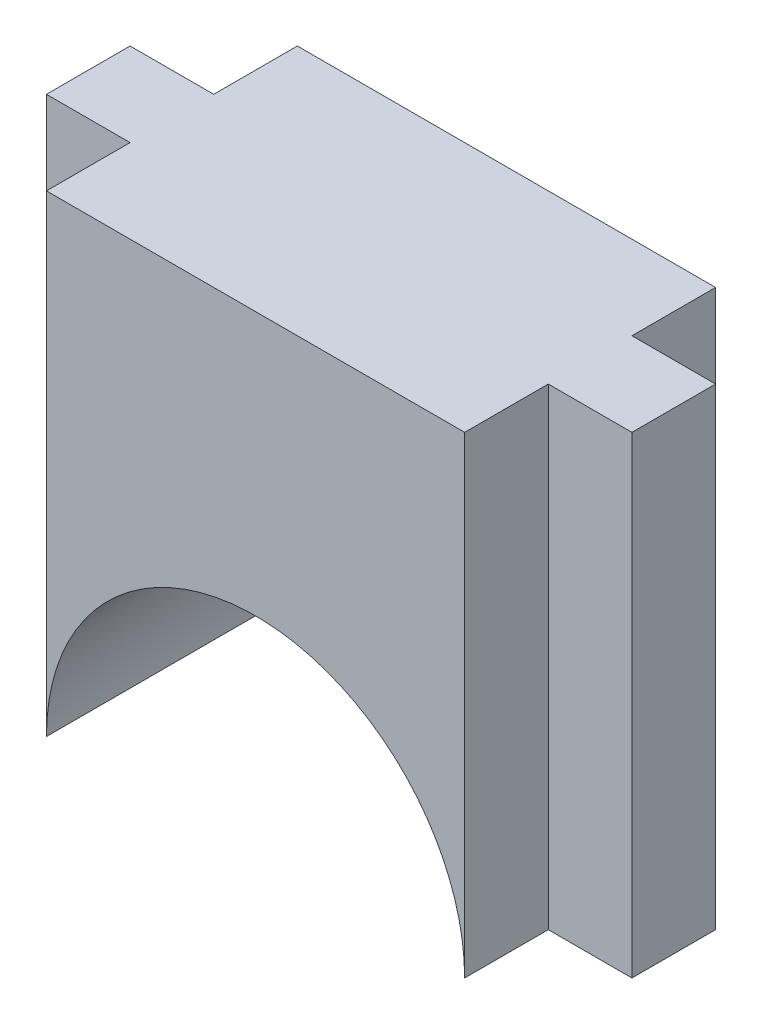
ISO-10303-21;
HEADER;
FILE_DESCRIPTION(('STEP AP214'),'2;1');
FILE_NAME('part.step','',(''),(''),'','','');
FILE_SCHEMA(('AUTOMOTIVE_DESIGN { 1 0 10303 214 1 1 1 1 }'));
ENDSEC;
DATA;
#1=APPLICATION_CONTEXT('core data for automotive mechanical design processes');
#2=APPLICATION_PROTOCOL_DEFINITION('international standard','automotive_design',2000,#1);
#3=PRODUCT_CONTEXT('',#1,'mechanical');
#4=PRODUCT('Part','Part','',(#3));
#5=PRODUCT_RELATED_PRODUCT_CATEGORY('part','',(#4));
#6=PRODUCT_DEFINITION_FORMATION('','',#4);
#7=PRODUCT_DEFINITION_CONTEXT('part definition',#1,'design');
#8=PRODUCT_DEFINITION('design','',#6,#7);
#9=PRODUCT_DEFINITION_SHAPE('','',#8);
#10=(LENGTH_UNIT() NAMED_UNIT(*) SI_UNIT(.MILLI.,.METRE.));
#11=(NAMED_UNIT(*) PLANE_ANGLE_UNIT() SI_UNIT($,.RADIAN.));
#12=(NAMED_UNIT(*) SI_UNIT($,.STERADIAN.) SOLID_ANGLE_UNIT());
#13=UNCERTAINTY_MEASURE_WITH_UNIT(LENGTH_MEASURE(1.E-05),#10,'distance_accuracy_value','');
#14=(GEOMETRIC_REPRESENTATION_CONTEXT(3) GLOBAL_UNCERTAINTY_ASSIGNED_CONTEXT((#13)) GLOBAL_UNIT_ASSIGNED_CONTEXT((#10,
#11,#12)) REPRESENTATION_CONTEXT('',''));
#15=CARTESIAN_POINT('',(0.,0.,0.));
#16=DIRECTION('',(0.,0.,1.));
#17=DIRECTION('',(1.,0.,0.));
#18=AXIS2_PLACEMENT_3D('',#15,#16,#17);
#19=CARTESIAN_POINT('',(-7.50000000000001,16.9500000000004,9.));
#20=DIRECTION('',(1.,0.,0.));
#21=DIRECTION('',(0.,0.,-1.));
#22=AXIS2_PLACEMENT_3D('',#19,#20,#21);
#23=PLANE('',#22);
#24=DIRECTION('',(0.,0.,-1.));
#25=VECTOR('',#24,1.);
#26=CARTESIAN_POINT('',(-7.50000000000001,16.9500000000004,9.));
#27=LINE('',#26,#25);
#28=CARTESIAN_POINT('',(-7.50000000000001,16.9500000000004,9.));
#29=VERTEX_POINT('',#28);
#30=CARTESIAN_POINT('',(-7.50000000000001,16.9500000000004,6.));
#31=VERTEX_POINT('',#30);
#32=EDGE_CURVE('E215',#29,#31,#27,.T.);
#33=ORIENTED_EDGE('',*,*,#32,.T.);
#34=DIRECTION('',(0.,-1.,0.));
#35=VECTOR('',#34,1.);
#36=CARTESIAN_POINT('',(-7.50000000000001,16.9500000000004,6.));
#37=LINE('',#36,#35);
#38=CARTESIAN_POINT('',(-7.50000000000001,0.,6.));
#39=VERTEX_POINT('',#38);
#40=EDGE_CURVE('E133',#31,#39,#37,.T.);
#41=ORIENTED_EDGE('',*,*,#40,.T.);
#42=DIRECTION('',(0.,0.,-1.));
#43=VECTOR('',#42,1.);
#44=CARTESIAN_POINT('',(-7.50000000000001,0.,9.));
#45=LINE('',#44,#43);
#46=CARTESIAN_POINT('',(-7.50000000000001,0.,9.));
#47=VERTEX_POINT('',#46);
#48=EDGE_CURVE('E211',#47,#39,#45,.T.);
#49=ORIENTED_EDGE('',*,*,#48,.F.);
#50=DIRECTION('',(0.,-1.,0.));
#51=VECTOR('',#50,1.);
#52=CARTESIAN_POINT('',(-7.50000000000001,16.9500000000004,9.));
#53=LINE('',#52,#51);
#54=EDGE_CURVE('E199',#29,#47,#53,.T.);
#55=ORIENTED_EDGE('',*,*,#54,.F.);
#56=EDGE_LOOP('',(#33,#41,#49,#55));
#57=FACE_BOUND('',#56,.T.);
#58=ADVANCED_FACE('F37',(#57),#23,.F.);
#59=CARTESIAN_POINT('',(7.50000000000001,0.,9.));
#60=DIRECTION('',(-1.,0.,0.));
#61=DIRECTION('',(0.,0.,1.));
#62=AXIS2_PLACEMENT_3D('',#59,#60,#61);
#63=PLANE('',#62);
#64=DIRECTION('',(0.,-1.,0.));
#65=VECTOR('',#64,1.);
#66=CARTESIAN_POINT('',(7.50000000000001,16.9500000000004,6.));
#67=LINE('',#66,#65);
#68=CARTESIAN_POINT('',(7.50000000000001,16.9500000000004,6.));
#69=VERTEX_POINT('',#68);
#70=CARTESIAN_POINT('',(7.50000000000001,0.,6.));
#71=VERTEX_POINT('',#70);
#72=EDGE_CURVE('E137',#69,#71,#67,.T.);
#73=ORIENTED_EDGE('',*,*,#72,.F.);
#74=DIRECTION('',(0.,0.,-1.));
#75=VECTOR('',#74,1.);
#76=CARTESIAN_POINT('',(7.50000000000001,16.9500000000004,9.));
#77=LINE('',#76,#75);
#78=CARTESIAN_POINT('',(7.50000000000001,16.9500000000004,9.));
#79=VERTEX_POINT('',#78);
#80=EDGE_CURVE('E217',#79,#69,#77,.T.);
#81=ORIENTED_EDGE('',*,*,#80,.F.);
#82=DIRECTION('',(0.,1.,0.));
#83=VECTOR('',#82,1.);
#84=CARTESIAN_POINT('',(7.50000000000001,0.,9.));
#85=LINE('',#84,#83);
#86=CARTESIAN_POINT('',(7.50000000000001,0.,9.));
#87=VERTEX_POINT('',#86);
#88=EDGE_CURVE('E194',#87,#79,#85,.T.);
#89=ORIENTED_EDGE('',*,*,#88,.F.);
#90=DIRECTION('',(0.,0.,-1.));
#91=VECTOR('',#90,1.);
#92=CARTESIAN_POINT('',(7.50000000000001,0.,9.));
#93=LINE('',#92,#91);
#94=EDGE_CURVE('E11',#87,#71,#93,.T.);
#95=ORIENTED_EDGE('',*,*,#94,.T.);
#96=EDGE_LOOP('',(#73,#81,#89,#95));
#97=FACE_BOUND('',#96,.T.);
#98=ADVANCED_FACE('F249',(#97),#63,.F.);
#99=DIRECTION('',(0.,1.,0.));
#100=VECTOR('',#99,1.);
#101=CARTESIAN_POINT('',(7.50000000000001,16.9500000000004,3.));
#102=LINE('',#101,#100);
#103=CARTESIAN_POINT('',(7.50000000000001,0.,3.));
#104=VERTEX_POINT('',#103);
#105=CARTESIAN_POINT('',(7.50000000000001,16.9500000000004,3.));
#106=VERTEX_POINT('',#105);
#107=EDGE_CURVE('E171',#104,#106,#102,.T.);
#108=ORIENTED_EDGE('',*,*,#107,.F.);
#109=CARTESIAN_POINT('',(7.50000000000001,0.,0.));
#110=VERTEX_POINT('',#109);
#111=EDGE_CURVE('E45',#104,#110,#93,.T.);
#112=ORIENTED_EDGE('',*,*,#111,.T.);
#113=DIRECTION('',(0.,1.,0.));
#114=VECTOR('',#113,1.);
#115=CARTESIAN_POINT('',(7.50000000000001,0.,0.));
#116=LINE('',#115,#114);
#117=CARTESIAN_POINT('',(7.50000000000001,16.9500000000004,0.));
#118=VERTEX_POINT('',#117);
#119=EDGE_CURVE('E204',#110,#118,#116,.T.);
#120=ORIENTED_EDGE('',*,*,#119,.T.);
#121=EDGE_CURVE('E216',#106,#118,#77,.T.);
#122=ORIENTED_EDGE('',*,*,#121,.F.);
#123=EDGE_LOOP('',(#108,#112,#120,#122));
#124=FACE_BOUND('',#123,.T.);
#125=ADVANCED_FACE('F228',(#124),#63,.F.);
#126=CARTESIAN_POINT('',(0.,0.,9.));
#127=DIRECTION('',(0.,0.,-1.));
#128=DIRECTION('',(-1.,0.,0.));
#129=AXIS2_PLACEMENT_3D('',#126,#127,#128);
#130=CYLINDRICAL_SURFACE('',#129,7.50000000000001);
#131=CARTESIAN_POINT('',(0.,0.,0.));
#132=DIRECTION('',(0.,0.,-1.));
#133=DIRECTION('',(1.,0.,0.));
#134=AXIS2_PLACEMENT_3D('',#131,#132,#133);
#135=CIRCLE('',#134,7.50000000000001);
#136=CARTESIAN_POINT('',(-7.50000000000001,0.,0.));
#137=VERTEX_POINT('',#136);
#138=EDGE_CURVE('E190',#137,#110,#135,.T.);
#139=ORIENTED_EDGE('',*,*,#138,.T.);
#140=ORIENTED_EDGE('',*,*,#111,.F.);
#141=DIRECTION('',(0.,0.,-1.));
#142=VECTOR('',#141,1.);
#143=CARTESIAN_POINT('',(7.50000000000001,0.,6.));
#144=LINE('',#143,#142);
#145=EDGE_CURVE('E180',#71,#104,#144,.T.);
#146=ORIENTED_EDGE('',*,*,#145,.F.);
#147=ORIENTED_EDGE('',*,*,#94,.F.);
#148=CARTESIAN_POINT('',(0.,0.,9.));
#149=DIRECTION('',(0.,0.,-1.));
#150=DIRECTION('',(1.,0.,0.));
#151=AXIS2_PLACEMENT_3D('',#148,#149,#150);
#152=CIRCLE('',#151,7.50000000000001);
#153=EDGE_CURVE('E191',#47,#87,#152,.T.);
#154=ORIENTED_EDGE('',*,*,#153,.F.);
#155=ORIENTED_EDGE('',*,*,#48,.T.);
#156=DIRECTION('',(0.,0.,-1.));
#157=VECTOR('',#156,1.);
#158=CARTESIAN_POINT('',(-7.50000000000001,0.,6.));
#159=LINE('',#158,#157);
#160=CARTESIAN_POINT('',(-7.50000000000001,0.,3.));
#161=VERTEX_POINT('',#160);
#162=EDGE_CURVE('E148',#39,#161,#159,.T.);
#163=ORIENTED_EDGE('',*,*,#162,.T.);
#164=EDGE_CURVE('E201',#161,#137,#45,.T.);
#165=ORIENTED_EDGE('',*,*,#164,.T.);
#166=EDGE_LOOP('',(#139,#140,#146,#147,#154,#155,#163,#165));
#167=FACE_BOUND('',#166,.T.);
#168=ADVANCED_FACE('F39',(#167),#130,.F.);
#169=CARTESIAN_POINT('',(-7.50000000000001,16.9500000000004,9.));
#170=DIRECTION('',(0.,-1.,0.));
#171=DIRECTION('',(0.,0.,-1.));
#172=AXIS2_PLACEMENT_3D('',#169,#170,#171);
#173=PLANE('',#172);
#174=DIRECTION('',(-1.,0.,0.));
#175=VECTOR('',#174,1.);
#176=CARTESIAN_POINT('',(-7.50000000000001,16.9500000000004,0.));
#177=LINE('',#176,#175);
#178=CARTESIAN_POINT('',(-7.50000000000001,16.9500000000004,0.));
#179=VERTEX_POINT('',#178);
#180=EDGE_CURVE('E207',#118,#179,#177,.T.);
#181=ORIENTED_EDGE('',*,*,#180,.T.);
#182=CARTESIAN_POINT('',(-7.50000000000001,16.9500000000004,3.));
#183=VERTEX_POINT('',#182);
#184=EDGE_CURVE('E214',#183,#179,#27,.T.);
#185=ORIENTED_EDGE('',*,*,#184,.F.);
#186=DIRECTION('',(1.,0.,0.));
#187=VECTOR('',#186,1.);
#188=CARTESIAN_POINT('',(-10.5,16.9500000000004,3.));
#189=LINE('',#188,#187);
#190=CARTESIAN_POINT('',(-10.5,16.9500000000004,3.));
#191=VERTEX_POINT('',#190);
#192=EDGE_CURVE('E138',#191,#183,#189,.T.);
#193=ORIENTED_EDGE('',*,*,#192,.F.);
#194=DIRECTION('',(0.,0.,1.));
#195=VECTOR('',#194,1.);
#196=CARTESIAN_POINT('',(-10.5,16.9500000000004,6.));
#197=LINE('',#196,#195);
#198=CARTESIAN_POINT('',(-10.5,16.9500000000004,6.));
#199=VERTEX_POINT('',#198);
#200=EDGE_CURVE('E144',#191,#199,#197,.T.);
#201=ORIENTED_EDGE('',*,*,#200,.T.);
#202=DIRECTION('',(1.,0.,0.));
#203=VECTOR('',#202,1.);
#204=CARTESIAN_POINT('',(-10.5,16.9500000000004,6.));
#205=LINE('',#204,#203);
#206=EDGE_CURVE('E127',#199,#31,#205,.T.);
#207=ORIENTED_EDGE('',*,*,#206,.T.);
#208=ORIENTED_EDGE('',*,*,#32,.F.);
#209=DIRECTION('',(-1.,0.,0.));
#210=VECTOR('',#209,1.);
#211=CARTESIAN_POINT('',(-7.50000000000001,16.9500000000004,9.));
#212=LINE('',#211,#210);
#213=EDGE_CURVE('E197',#79,#29,#212,.T.);
#214=ORIENTED_EDGE('',*,*,#213,.F.);
#215=ORIENTED_EDGE('',*,*,#80,.T.);
#216=DIRECTION('',(-1.,0.,0.));
#217=VECTOR('',#216,1.);
#218=CARTESIAN_POINT('',(10.5,16.9500000000004,6.));
#219=LINE('',#218,#217);
#220=CARTESIAN_POINT('',(10.5,16.9500000000004,6.));
#221=VERTEX_POINT('',#220);
#222=EDGE_CURVE('E177',#221,#69,#219,.T.);
#223=ORIENTED_EDGE('',*,*,#222,.F.);
#224=DIRECTION('',(0.,0.,1.));
#225=VECTOR('',#224,1.);
#226=CARTESIAN_POINT('',(10.5,16.9500000000004,6.));
#227=LINE('',#226,#225);
#228=CARTESIAN_POINT('',(10.5,16.9500000000004,3.));
#229=VERTEX_POINT('',#228);
#230=EDGE_CURVE('E175',#229,#221,#227,.T.);
#231=ORIENTED_EDGE('',*,*,#230,.F.);
#232=DIRECTION('',(-1.,0.,0.));
#233=VECTOR('',#232,1.);
#234=CARTESIAN_POINT('',(10.5,16.9500000000004,3.));
#235=LINE('',#234,#233);
#236=EDGE_CURVE('E60',#229,#106,#235,.T.);
#237=ORIENTED_EDGE('',*,*,#236,.T.);
#238=ORIENTED_EDGE('',*,*,#121,.T.);
#239=EDGE_LOOP('',(#181,#185,#193,#201,#207,#208,#214,#215,#223,#231,#237,#238));
#240=FACE_BOUND('',#239,.T.);
#241=ADVANCED_FACE('F151',(#240),#173,.F.);
#242=ORIENTED_EDGE('',*,*,#164,.F.);
#243=DIRECTION('',(0.,1.,0.));
#244=VECTOR('',#243,1.);
#245=CARTESIAN_POINT('',(-7.50000000000001,16.9500000000004,3.));
#246=LINE('',#245,#244);
#247=EDGE_CURVE('E52',#161,#183,#246,.T.);
#248=ORIENTED_EDGE('',*,*,#247,.T.);
#249=ORIENTED_EDGE('',*,*,#184,.T.);
#250=DIRECTION('',(0.,-1.,0.));
#251=VECTOR('',#250,1.);
#252=CARTESIAN_POINT('',(-7.50000000000001,16.9500000000004,0.));
#253=LINE('',#252,#251);
#254=EDGE_CURVE('E195',#179,#137,#253,.T.);
#255=ORIENTED_EDGE('',*,*,#254,.T.);
#256=EDGE_LOOP('',(#242,#248,#249,#255));
#257=FACE_BOUND('',#256,.T.);
#258=ADVANCED_FACE('F235',(#257),#23,.F.);
#259=CARTESIAN_POINT('',(0.,0.,9.));
#260=DIRECTION('',(0.,0.,1.));
#261=DIRECTION('',(1.,0.,0.));
#262=AXIS2_PLACEMENT_3D('',#259,#260,#261);
#263=PLANE('',#262);
#264=ORIENTED_EDGE('',*,*,#153,.T.);
#265=ORIENTED_EDGE('',*,*,#88,.T.);
#266=ORIENTED_EDGE('',*,*,#213,.T.);
#267=ORIENTED_EDGE('',*,*,#54,.T.);
#268=EDGE_LOOP('',(#264,#265,#266,#267));
#269=FACE_BOUND('',#268,.T.);
#270=ADVANCED_FACE('F245',(#269),#263,.T.);
#271=CARTESIAN_POINT('',(0.,0.,0.));
#272=DIRECTION('',(0.,0.,1.));
#273=DIRECTION('',(1.,0.,0.));
#274=AXIS2_PLACEMENT_3D('',#271,#272,#273);
#275=PLANE('',#274);
#276=ORIENTED_EDGE('',*,*,#138,.F.);
#277=ORIENTED_EDGE('',*,*,#254,.F.);
#278=ORIENTED_EDGE('',*,*,#180,.F.);
#279=ORIENTED_EDGE('',*,*,#119,.F.);
#280=EDGE_LOOP('',(#276,#277,#278,#279));
#281=FACE_BOUND('',#280,.T.);
#282=ADVANCED_FACE('F232',(#281),#275,.F.);
#283=CARTESIAN_POINT('',(10.5,16.9500000000004,6.));
#284=DIRECTION('',(0.,0.,-1.));
#285=DIRECTION('',(0.,1.,0.));
#286=AXIS2_PLACEMENT_3D('',#283,#284,#285);
#287=PLANE('',#286);
#288=ORIENTED_EDGE('',*,*,#72,.T.);
#289=DIRECTION('',(-1.,0.,0.));
#290=VECTOR('',#289,1.);
#291=CARTESIAN_POINT('',(10.5,0.,6.));
#292=LINE('',#291,#290);
#293=CARTESIAN_POINT('',(10.5,0.,6.));
#294=VERTEX_POINT('',#293);
#295=EDGE_CURVE('E188',#294,#71,#292,.T.);
#296=ORIENTED_EDGE('',*,*,#295,.F.);
#297=DIRECTION('',(0.,-1.,0.));
#298=VECTOR('',#297,1.);
#299=CARTESIAN_POINT('',(10.5,16.9500000000004,6.));
#300=LINE('',#299,#298);
#301=EDGE_CURVE('E167',#221,#294,#300,.T.);
#302=ORIENTED_EDGE('',*,*,#301,.F.);
#303=ORIENTED_EDGE('',*,*,#222,.T.);
#304=EDGE_LOOP('',(#288,#296,#302,#303));
#305=FACE_BOUND('',#304,.T.);
#306=ADVANCED_FACE('F253',(#305),#287,.F.);
#307=CARTESIAN_POINT('',(10.5,0.,6.));
#308=DIRECTION('',(0.,1.,0.));
#309=DIRECTION('',(0.,0.,1.));
#310=AXIS2_PLACEMENT_3D('',#307,#308,#309);
#311=PLANE('',#310);
#312=ORIENTED_EDGE('',*,*,#145,.T.);
#313=DIRECTION('',(-1.,0.,0.));
#314=VECTOR('',#313,1.);
#315=CARTESIAN_POINT('',(10.5,0.,3.));
#316=LINE('',#315,#314);
#317=CARTESIAN_POINT('',(10.5,0.,3.));
#318=VERTEX_POINT('',#317);
#319=EDGE_CURVE('E185',#318,#104,#316,.T.);
#320=ORIENTED_EDGE('',*,*,#319,.F.);
#321=DIRECTION('',(0.,0.,-1.));
#322=VECTOR('',#321,1.);
#323=CARTESIAN_POINT('',(10.5,0.,6.));
#324=LINE('',#323,#322);
#325=EDGE_CURVE('E170',#294,#318,#324,.T.);
#326=ORIENTED_EDGE('',*,*,#325,.F.);
#327=ORIENTED_EDGE('',*,*,#295,.T.);
#328=EDGE_LOOP('',(#312,#320,#326,#327));
#329=FACE_BOUND('',#328,.T.);
#330=ADVANCED_FACE('F257',(#329),#311,.F.);
#331=CARTESIAN_POINT('',(10.5,16.9500000000004,3.));
#332=DIRECTION('',(0.,0.,1.));
#333=DIRECTION('',(0.,-1.,0.));
#334=AXIS2_PLACEMENT_3D('',#331,#332,#333);
#335=PLANE('',#334);
#336=ORIENTED_EDGE('',*,*,#107,.T.);
#337=ORIENTED_EDGE('',*,*,#236,.F.);
#338=DIRECTION('',(0.,1.,0.));
#339=VECTOR('',#338,1.);
#340=CARTESIAN_POINT('',(10.5,16.9500000000004,3.));
#341=LINE('',#340,#339);
#342=EDGE_CURVE('E173',#318,#229,#341,.T.);
#343=ORIENTED_EDGE('',*,*,#342,.F.);
#344=ORIENTED_EDGE('',*,*,#319,.T.);
#345=EDGE_LOOP('',(#336,#337,#343,#344));
#346=FACE_BOUND('',#345,.T.);
#347=ADVANCED_FACE('F260',(#346),#335,.F.);
#348=CARTESIAN_POINT('',(10.5,0.,0.));
#349=DIRECTION('',(1.,0.,0.));
#350=DIRECTION('',(0.,0.,-1.));
#351=AXIS2_PLACEMENT_3D('',#348,#349,#350);
#352=PLANE('',#351);
#353=ORIENTED_EDGE('',*,*,#301,.T.);
#354=ORIENTED_EDGE('',*,*,#325,.T.);
#355=ORIENTED_EDGE('',*,*,#342,.T.);
#356=ORIENTED_EDGE('',*,*,#230,.T.);
#357=EDGE_LOOP('',(#353,#354,#355,#356));
#358=FACE_BOUND('',#357,.T.);
#359=ADVANCED_FACE('F262',(#358),#352,.T.);
#360=CARTESIAN_POINT('',(-10.5,16.9500000000004,6.));
#361=DIRECTION('',(0.,0.,1.));
#362=DIRECTION('',(0.,-1.,0.));
#363=AXIS2_PLACEMENT_3D('',#360,#361,#362);
#364=PLANE('',#363);
#365=ORIENTED_EDGE('',*,*,#40,.F.);
#366=ORIENTED_EDGE('',*,*,#206,.F.);
#367=DIRECTION('',(0.,-1.,0.));
#368=VECTOR('',#367,1.);
#369=CARTESIAN_POINT('',(-10.5,16.9500000000004,6.));
#370=LINE('',#369,#368);
#371=CARTESIAN_POINT('',(-10.5,0.,6.));
#372=VERTEX_POINT('',#371);
#373=EDGE_CURVE('E130',#199,#372,#370,.T.);
#374=ORIENTED_EDGE('',*,*,#373,.T.);
#375=DIRECTION('',(1.,0.,0.));
#376=VECTOR('',#375,1.);
#377=CARTESIAN_POINT('',(-10.5,0.,6.));
#378=LINE('',#377,#376);
#379=EDGE_CURVE('E158',#372,#39,#378,.T.);
#380=ORIENTED_EDGE('',*,*,#379,.T.);
#381=EDGE_LOOP('',(#365,#366,#374,#380));
#382=FACE_BOUND('',#381,.T.);
#383=ADVANCED_FACE('F129',(#382),#364,.T.);
#384=CARTESIAN_POINT('',(-10.5,16.9500000000004,3.));
#385=DIRECTION('',(0.,0.,-1.));
#386=DIRECTION('',(0.,1.,0.));
#387=AXIS2_PLACEMENT_3D('',#384,#385,#386);
#388=PLANE('',#387);
#389=ORIENTED_EDGE('',*,*,#247,.F.);
#390=DIRECTION('',(1.,0.,0.));
#391=VECTOR('',#390,1.);
#392=CARTESIAN_POINT('',(-10.5,0.,3.));
#393=LINE('',#392,#391);
#394=CARTESIAN_POINT('',(-10.5,0.,3.));
#395=VERTEX_POINT('',#394);
#396=EDGE_CURVE('E164',#395,#161,#393,.T.);
#397=ORIENTED_EDGE('',*,*,#396,.F.);
#398=DIRECTION('',(0.,1.,0.));
#399=VECTOR('',#398,1.);
#400=CARTESIAN_POINT('',(-10.5,16.9500000000004,3.));
#401=LINE('',#400,#399);
#402=EDGE_CURVE('E153',#395,#191,#401,.T.);
#403=ORIENTED_EDGE('',*,*,#402,.T.);
#404=ORIENTED_EDGE('',*,*,#192,.T.);
#405=EDGE_LOOP('',(#389,#397,#403,#404));
#406=FACE_BOUND('',#405,.T.);
#407=ADVANCED_FACE('F269',(#406),#388,.T.);
#408=CARTESIAN_POINT('',(-10.5,0.,6.));
#409=DIRECTION('',(0.,-1.,0.));
#410=DIRECTION('',(0.,0.,-1.));
#411=AXIS2_PLACEMENT_3D('',#408,#409,#410);
#412=PLANE('',#411);
#413=ORIENTED_EDGE('',*,*,#162,.F.);
#414=ORIENTED_EDGE('',*,*,#379,.F.);
#415=DIRECTION('',(0.,0.,-1.));
#416=VECTOR('',#415,1.);
#417=CARTESIAN_POINT('',(-10.5,0.,6.));
#418=LINE('',#417,#416);
#419=EDGE_CURVE('E147',#372,#395,#418,.T.);
#420=ORIENTED_EDGE('',*,*,#419,.T.);
#421=ORIENTED_EDGE('',*,*,#396,.T.);
#422=EDGE_LOOP('',(#413,#414,#420,#421));
#423=FACE_BOUND('',#422,.T.);
#424=ADVANCED_FACE('F241',(#423),#412,.T.);
#425=CARTESIAN_POINT('',(-10.5,0.,0.));
#426=DIRECTION('',(-1.,0.,0.));
#427=DIRECTION('',(0.,0.,-1.));
#428=AXIS2_PLACEMENT_3D('',#425,#426,#427);
#429=PLANE('',#428);
#430=ORIENTED_EDGE('',*,*,#373,.F.);
#431=ORIENTED_EDGE('',*,*,#200,.F.);
#432=ORIENTED_EDGE('',*,*,#402,.F.);
#433=ORIENTED_EDGE('',*,*,#419,.F.);
#434=EDGE_LOOP('',(#430,#431,#432,#433));
#435=FACE_BOUND('',#434,.T.);
#436=ADVANCED_FACE('F142',(#435),#429,.T.);
#437=CLOSED_SHELL('',(#58,#98,#125,#168,#241,#258,#270,#282,#306,#330,#347,#359,#383,#407,#424,#436));
#438=MANIFOLD_SOLID_BREP('B2',#437);
#439=ADVANCED_BREP_SHAPE_REPRESENTATION('',(#18,#438),#14);
#440=SHAPE_DEFINITION_REPRESENTATION(#9,#439);
ENDSEC;
END-ISO-10303-21;
